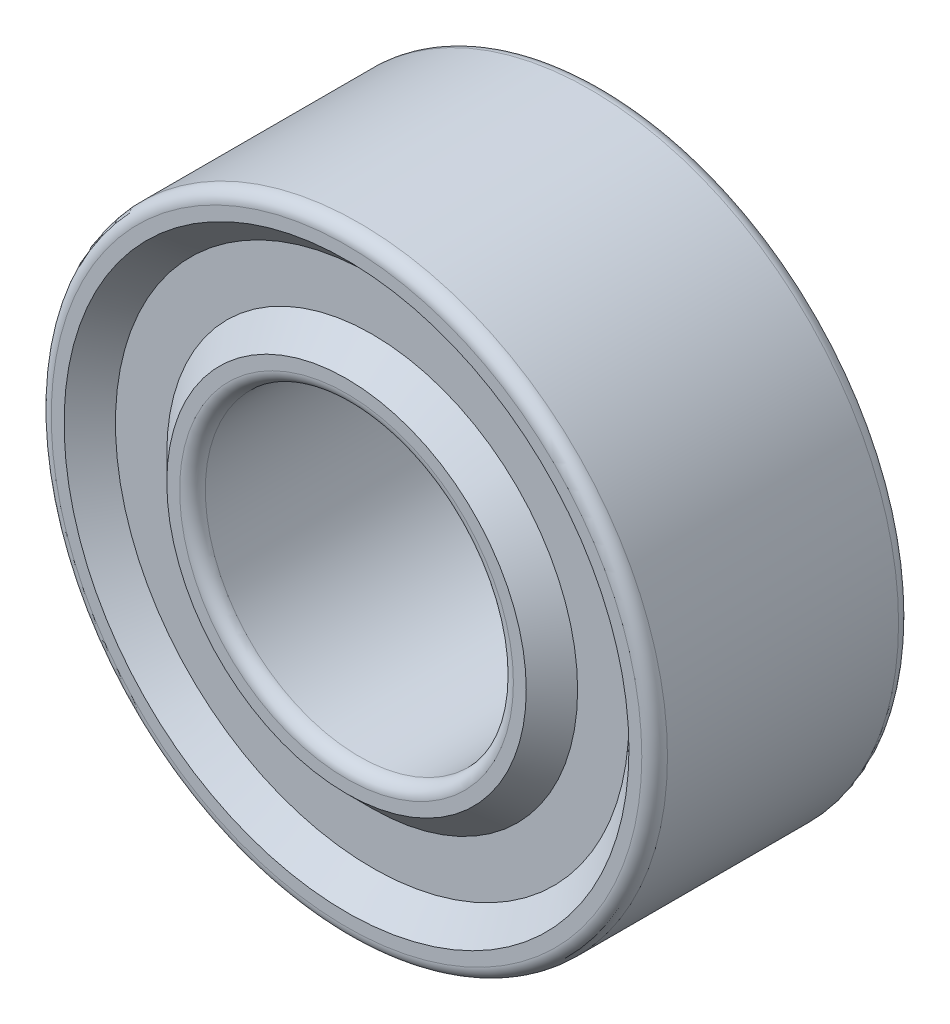
ISO-10303-21;
HEADER;
FILE_DESCRIPTION(('STEP AP214'),'2;1');
FILE_NAME('part.step','',(''),(''),'','','');
FILE_SCHEMA(('AUTOMOTIVE_DESIGN { 1 0 10303 214 1 1 1 1 }'));
ENDSEC;
DATA;
#1=APPLICATION_CONTEXT('core data for automotive mechanical design processes');
#2=APPLICATION_PROTOCOL_DEFINITION('international standard','automotive_design',2000,#1);
#3=PRODUCT_CONTEXT('',#1,'mechanical');
#4=PRODUCT('Part','Part','',(#3));
#5=PRODUCT_RELATED_PRODUCT_CATEGORY('part','',(#4));
#6=PRODUCT_DEFINITION_FORMATION('','',#4);
#7=PRODUCT_DEFINITION_CONTEXT('part definition',#1,'design');
#8=PRODUCT_DEFINITION('design','',#6,#7);
#9=PRODUCT_DEFINITION_SHAPE('','',#8);
#10=(LENGTH_UNIT() NAMED_UNIT(*) SI_UNIT(.MILLI.,.METRE.));
#11=(NAMED_UNIT(*) PLANE_ANGLE_UNIT() SI_UNIT($,.RADIAN.));
#12=(NAMED_UNIT(*) SI_UNIT($,.STERADIAN.) SOLID_ANGLE_UNIT());
#13=UNCERTAINTY_MEASURE_WITH_UNIT(LENGTH_MEASURE(1.E-05),#10,'distance_accuracy_value','');
#14=(GEOMETRIC_REPRESENTATION_CONTEXT(3) GLOBAL_UNCERTAINTY_ASSIGNED_CONTEXT((#13)) GLOBAL_UNIT_ASSIGNED_CONTEXT((#10,
#11,#12)) REPRESENTATION_CONTEXT('',''));
#15=CARTESIAN_POINT('',(0.,0.,0.));
#16=DIRECTION('',(0.,0.,1.));
#17=DIRECTION('',(1.,0.,0.));
#18=AXIS2_PLACEMENT_3D('',#15,#16,#17);
#19=CARTESIAN_POINT('',(0.,0.,0.));
#20=DIRECTION('',(0.,0.,1.));
#21=DIRECTION('',(1.,0.,0.));
#22=AXIS2_PLACEMENT_3D('',#19,#20,#21);
#23=PLANE('',#22);
#24=CARTESIAN_POINT('',(0.,0.,0.));
#25=DIRECTION('',(0.,0.,1.));
#26=DIRECTION('',(1.,0.,0.));
#27=AXIS2_PLACEMENT_3D('',#24,#25,#26);
#28=CIRCLE('',#27,1.625);
#29=CARTESIAN_POINT('',(1.625,0.,0.));
#30=VERTEX_POINT('',#29);
#31=EDGE_CURVE('E64',#30,#30,#28,.T.);
#32=ORIENTED_EDGE('',*,*,#31,.T.);
#33=EDGE_LOOP('',(#32));
#34=FACE_BOUND('',#33,.T.);
#35=CARTESIAN_POINT('',(0.,0.,0.));
#36=DIRECTION('',(0.,0.,1.));
#37=DIRECTION('',(1.,0.,0.));
#38=AXIS2_PLACEMENT_3D('',#35,#36,#37);
#39=CIRCLE('',#38,1.75);
#40=CARTESIAN_POINT('',(1.75,0.,0.));
#41=VERTEX_POINT('',#40);
#42=EDGE_CURVE('E97',#41,#41,#39,.T.);
#43=ORIENTED_EDGE('',*,*,#42,.F.);
#44=EDGE_LOOP('',(#43));
#45=FACE_BOUND('',#44,.T.);
#46=ADVANCED_FACE('F43',(#34,#45),#23,.F.);
#47=CARTESIAN_POINT('',(0.,0.,2.5));
#48=DIRECTION('',(0.,0.,1.));
#49=DIRECTION('',(1.,0.,0.));
#50=AXIS2_PLACEMENT_3D('',#47,#48,#49);
#51=PLANE('',#50);
#52=CARTESIAN_POINT('',(0.,0.,2.5));
#53=DIRECTION('',(0.,0.,1.));
#54=DIRECTION('',(1.,0.,0.));
#55=AXIS2_PLACEMENT_3D('',#52,#53,#54);
#56=CIRCLE('',#55,1.625);
#57=CARTESIAN_POINT('',(1.625,0.,2.5));
#58=VERTEX_POINT('',#57);
#59=EDGE_CURVE('E79',#58,#58,#56,.F.);
#60=ORIENTED_EDGE('',*,*,#59,.T.);
#61=EDGE_LOOP('',(#60));
#62=FACE_BOUND('',#61,.T.);
#63=CARTESIAN_POINT('',(0.,0.,2.5));
#64=DIRECTION('',(0.,0.,1.));
#65=DIRECTION('',(1.,0.,0.));
#66=AXIS2_PLACEMENT_3D('',#63,#64,#65);
#67=CIRCLE('',#66,1.75);
#68=CARTESIAN_POINT('',(1.75,0.,2.5));
#69=VERTEX_POINT('',#68);
#70=EDGE_CURVE('E91',#69,#69,#67,.T.);
#71=ORIENTED_EDGE('',*,*,#70,.T.);
#72=EDGE_LOOP('',(#71));
#73=FACE_BOUND('',#72,.T.);
#74=ADVANCED_FACE('F105',(#62,#73),#51,.T.);
#75=CARTESIAN_POINT('',(0.,0.,2.5));
#76=DIRECTION('',(0.,0.,1.));
#77=DIRECTION('',(1.,0.,0.));
#78=AXIS2_PLACEMENT_3D('',#75,#76,#77);
#79=CIRCLE('',#78,2.875);
#80=CARTESIAN_POINT('',(2.875,0.,2.5));
#81=VERTEX_POINT('',#80);
#82=EDGE_CURVE('E76',#81,#81,#79,.T.);
#83=ORIENTED_EDGE('',*,*,#82,.T.);
#84=EDGE_LOOP('',(#83));
#85=FACE_BOUND('',#84,.T.);
#86=CARTESIAN_POINT('',(0.,0.,2.5));
#87=DIRECTION('',(0.,0.,1.));
#88=DIRECTION('',(1.,0.,0.));
#89=AXIS2_PLACEMENT_3D('',#86,#87,#88);
#90=CIRCLE('',#89,2.75);
#91=CARTESIAN_POINT('',(2.75,0.,2.5));
#92=VERTEX_POINT('',#91);
#93=EDGE_CURVE('E88',#92,#92,#90,.T.);
#94=ORIENTED_EDGE('',*,*,#93,.F.);
#95=EDGE_LOOP('',(#94));
#96=FACE_BOUND('',#95,.T.);
#97=ADVANCED_FACE('F112',(#85,#96),#51,.T.);
#98=CARTESIAN_POINT('',(0.,0.,0.));
#99=DIRECTION('',(0.,0.,1.));
#100=DIRECTION('',(1.,0.,0.));
#101=AXIS2_PLACEMENT_3D('',#98,#99,#100);
#102=CIRCLE('',#101,2.875);
#103=CARTESIAN_POINT('',(2.875,0.,0.));
#104=VERTEX_POINT('',#103);
#105=EDGE_CURVE('E67',#104,#104,#102,.F.);
#106=ORIENTED_EDGE('',*,*,#105,.T.);
#107=EDGE_LOOP('',(#106));
#108=FACE_BOUND('',#107,.T.);
#109=CARTESIAN_POINT('',(0.,0.,0.));
#110=DIRECTION('',(0.,0.,1.));
#111=DIRECTION('',(1.,0.,0.));
#112=AXIS2_PLACEMENT_3D('',#109,#110,#111);
#113=CIRCLE('',#112,2.75);
#114=CARTESIAN_POINT('',(2.75,0.,0.));
#115=VERTEX_POINT('',#114);
#116=EDGE_CURVE('E94',#115,#115,#113,.T.);
#117=ORIENTED_EDGE('',*,*,#116,.T.);
#118=EDGE_LOOP('',(#117));
#119=FACE_BOUND('',#118,.T.);
#120=ADVANCED_FACE('F108',(#108,#119),#23,.F.);
#121=CARTESIAN_POINT('',(0.,0.,2.5));
#122=DIRECTION('',(0.,0.,-1.));
#123=DIRECTION('',(-1.,0.,0.));
#124=AXIS2_PLACEMENT_3D('',#121,#122,#123);
#125=CYLINDRICAL_SURFACE('',#124,3.);
#126=CARTESIAN_POINT('',(0.,0.,2.375));
#127=DIRECTION('',(0.,0.,1.));
#128=DIRECTION('',(1.,0.,0.));
#129=AXIS2_PLACEMENT_3D('',#126,#127,#128);
#130=CIRCLE('',#129,3.);
#131=CARTESIAN_POINT('',(3.,0.,2.375));
#132=VERTEX_POINT('',#131);
#133=EDGE_CURVE('E70',#132,#132,#130,.F.);
#134=ORIENTED_EDGE('',*,*,#133,.T.);
#135=EDGE_LOOP('',(#134));
#136=FACE_BOUND('',#135,.T.);
#137=CARTESIAN_POINT('',(0.,0.,0.125));
#138=DIRECTION('',(0.,0.,1.));
#139=DIRECTION('',(1.,0.,0.));
#140=AXIS2_PLACEMENT_3D('',#137,#138,#139);
#141=CIRCLE('',#140,3.);
#142=CARTESIAN_POINT('',(3.,0.,0.125));
#143=VERTEX_POINT('',#142);
#144=EDGE_CURVE('E73',#143,#143,#141,.T.);
#145=ORIENTED_EDGE('',*,*,#144,.T.);
#146=EDGE_LOOP('',(#145));
#147=FACE_BOUND('',#146,.T.);
#148=ADVANCED_FACE('F117',(#136,#147),#125,.T.);
#149=CARTESIAN_POINT('',(0.,0.,2.5));
#150=DIRECTION('',(0.,0.,-1.));
#151=DIRECTION('',(-1.,0.,0.));
#152=AXIS2_PLACEMENT_3D('',#149,#150,#151);
#153=CYLINDRICAL_SURFACE('',#152,1.5);
#154=CARTESIAN_POINT('',(0.,0.,2.375));
#155=DIRECTION('',(0.,0.,1.));
#156=DIRECTION('',(1.,0.,0.));
#157=AXIS2_PLACEMENT_3D('',#154,#155,#156);
#158=CIRCLE('',#157,1.5);
#159=CARTESIAN_POINT('',(1.5,0.,2.375));
#160=VERTEX_POINT('',#159);
#161=EDGE_CURVE('E82',#160,#160,#158,.T.);
#162=ORIENTED_EDGE('',*,*,#161,.T.);
#163=EDGE_LOOP('',(#162));
#164=FACE_BOUND('',#163,.T.);
#165=CARTESIAN_POINT('',(0.,0.,0.125));
#166=DIRECTION('',(0.,0.,1.));
#167=DIRECTION('',(1.,0.,0.));
#168=AXIS2_PLACEMENT_3D('',#165,#166,#167);
#169=CIRCLE('',#168,1.5);
#170=CARTESIAN_POINT('',(1.5,0.,0.125));
#171=VERTEX_POINT('',#170);
#172=EDGE_CURVE('E85',#171,#171,#169,.F.);
#173=ORIENTED_EDGE('',*,*,#172,.T.);
#174=EDGE_LOOP('',(#173));
#175=FACE_BOUND('',#174,.T.);
#176=ADVANCED_FACE('F123',(#164,#175),#153,.F.);
#177=CARTESIAN_POINT('',(0.,0.,2.25));
#178=DIRECTION('',(0.,0.,1.));
#179=DIRECTION('',(1.,0.,0.));
#180=AXIS2_PLACEMENT_3D('',#177,#178,#179);
#181=PLANE('',#180);
#182=CARTESIAN_POINT('',(0.,0.,2.25));
#183=DIRECTION('',(0.,0.,1.));
#184=DIRECTION('',(1.,0.,0.));
#185=AXIS2_PLACEMENT_3D('',#182,#183,#184);
#186=CIRCLE('',#185,2.5);
#187=CARTESIAN_POINT('',(2.5,0.,2.25));
#188=VERTEX_POINT('',#187);
#189=EDGE_CURVE('E55',#188,#188,#186,.T.);
#190=ORIENTED_EDGE('',*,*,#189,.T.);
#191=EDGE_LOOP('',(#190));
#192=FACE_BOUND('',#191,.T.);
#193=CARTESIAN_POINT('',(0.,0.,2.25));
#194=DIRECTION('',(0.,0.,1.));
#195=DIRECTION('',(1.,0.,0.));
#196=AXIS2_PLACEMENT_3D('',#193,#194,#195);
#197=CIRCLE('',#196,2.);
#198=CARTESIAN_POINT('',(2.,0.,2.25));
#199=VERTEX_POINT('',#198);
#200=EDGE_CURVE('E59',#199,#199,#197,.F.);
#201=ORIENTED_EDGE('',*,*,#200,.T.);
#202=EDGE_LOOP('',(#201));
#203=FACE_BOUND('',#202,.T.);
#204=ADVANCED_FACE('F175',(#192,#203),#181,.T.);
#205=CARTESIAN_POINT('',(0.,0.,0.25));
#206=DIRECTION('',(0.,0.,1.));
#207=DIRECTION('',(1.,0.,0.));
#208=AXIS2_PLACEMENT_3D('',#205,#206,#207);
#209=PLANE('',#208);
#210=CARTESIAN_POINT('',(0.,0.,0.25));
#211=DIRECTION('',(0.,0.,1.));
#212=DIRECTION('',(1.,0.,0.));
#213=AXIS2_PLACEMENT_3D('',#210,#211,#212);
#214=CIRCLE('',#213,2.);
#215=CARTESIAN_POINT('',(2.,0.,0.25));
#216=VERTEX_POINT('',#215);
#217=EDGE_CURVE('E10',#216,#216,#214,.T.);
#218=ORIENTED_EDGE('',*,*,#217,.T.);
#219=EDGE_LOOP('',(#218));
#220=FACE_BOUND('',#219,.T.);
#221=CARTESIAN_POINT('',(0.,0.,0.25));
#222=DIRECTION('',(0.,0.,1.));
#223=DIRECTION('',(1.,0.,0.));
#224=AXIS2_PLACEMENT_3D('',#221,#222,#223);
#225=CIRCLE('',#224,2.5);
#226=CARTESIAN_POINT('',(2.5,0.,0.25));
#227=VERTEX_POINT('',#226);
#228=EDGE_CURVE('E51',#227,#227,#225,.F.);
#229=ORIENTED_EDGE('',*,*,#228,.T.);
#230=EDGE_LOOP('',(#229));
#231=FACE_BOUND('',#230,.T.);
#232=ADVANCED_FACE('F169',(#220,#231),#209,.F.);
#233=CARTESIAN_POINT('',(0.,0.,2.375));
#234=DIRECTION('',(0.,0.,1.));
#235=DIRECTION('',(1.,0.,0.));
#236=AXIS2_PLACEMENT_3D('',#233,#234,#235);
#237=TOROIDAL_SURFACE('',#236,1.625,0.125);
#238=ORIENTED_EDGE('',*,*,#59,.F.);
#239=EDGE_LOOP('',(#238));
#240=FACE_BOUND('',#239,.T.);
#241=ORIENTED_EDGE('',*,*,#161,.F.);
#242=EDGE_LOOP('',(#241));
#243=FACE_BOUND('',#242,.T.);
#244=ADVANCED_FACE('F166',(#240,#243),#237,.T.);
#245=CARTESIAN_POINT('',(0.,0.,2.375));
#246=DIRECTION('',(0.,0.,1.));
#247=DIRECTION('',(1.,0.,0.));
#248=AXIS2_PLACEMENT_3D('',#245,#246,#247);
#249=TOROIDAL_SURFACE('',#248,2.875,0.125);
#250=ORIENTED_EDGE('',*,*,#133,.F.);
#251=EDGE_LOOP('',(#250));
#252=FACE_BOUND('',#251,.T.);
#253=ORIENTED_EDGE('',*,*,#82,.F.);
#254=EDGE_LOOP('',(#253));
#255=FACE_BOUND('',#254,.T.);
#256=ADVANCED_FACE('F162',(#252,#255),#249,.T.);
#257=CARTESIAN_POINT('',(0.,0.,0.125));
#258=DIRECTION('',(0.,0.,1.));
#259=DIRECTION('',(1.,0.,0.));
#260=AXIS2_PLACEMENT_3D('',#257,#258,#259);
#261=TOROIDAL_SURFACE('',#260,2.875,0.125);
#262=ORIENTED_EDGE('',*,*,#105,.F.);
#263=EDGE_LOOP('',(#262));
#264=FACE_BOUND('',#263,.T.);
#265=ORIENTED_EDGE('',*,*,#144,.F.);
#266=EDGE_LOOP('',(#265));
#267=FACE_BOUND('',#266,.T.);
#268=ADVANCED_FACE('F158',(#264,#267),#261,.T.);
#269=CARTESIAN_POINT('',(0.,0.,0.125));
#270=DIRECTION('',(0.,0.,1.));
#271=DIRECTION('',(1.,0.,0.));
#272=AXIS2_PLACEMENT_3D('',#269,#270,#271);
#273=TOROIDAL_SURFACE('',#272,1.625,0.125);
#274=ORIENTED_EDGE('',*,*,#172,.F.);
#275=EDGE_LOOP('',(#274));
#276=FACE_BOUND('',#275,.T.);
#277=ORIENTED_EDGE('',*,*,#31,.F.);
#278=EDGE_LOOP('',(#277));
#279=FACE_BOUND('',#278,.T.);
#280=ADVANCED_FACE('F154',(#276,#279),#273,.T.);
#281=CARTESIAN_POINT('',(0.,0.,2.25));
#282=DIRECTION('',(0.,0.,1.));
#283=DIRECTION('',(1.,0.,0.));
#284=AXIS2_PLACEMENT_3D('',#281,#282,#283);
#285=CONICAL_SURFACE('',#284,2.5,0.785398163397452);
#286=ORIENTED_EDGE('',*,*,#93,.T.);
#287=EDGE_LOOP('',(#286));
#288=FACE_BOUND('',#287,.T.);
#289=ORIENTED_EDGE('',*,*,#189,.F.);
#290=EDGE_LOOP('',(#289));
#291=FACE_BOUND('',#290,.T.);
#292=ADVANCED_FACE('F139',(#288,#291),#285,.F.);
#293=CARTESIAN_POINT('',(0.,0.,2.5));
#294=DIRECTION('',(0.,0.,-1.));
#295=DIRECTION('',(-1.,0.,0.));
#296=AXIS2_PLACEMENT_3D('',#293,#294,#295);
#297=CONICAL_SURFACE('',#296,1.75,0.785398163397443);
#298=ORIENTED_EDGE('',*,*,#200,.F.);
#299=EDGE_LOOP('',(#298));
#300=FACE_BOUND('',#299,.T.);
#301=ORIENTED_EDGE('',*,*,#70,.F.);
#302=EDGE_LOOP('',(#301));
#303=FACE_BOUND('',#302,.T.);
#304=ADVANCED_FACE('F135',(#300,#303),#297,.T.);
#305=CARTESIAN_POINT('',(0.,0.,0.25));
#306=DIRECTION('',(0.,0.,1.));
#307=DIRECTION('',(1.,0.,0.));
#308=AXIS2_PLACEMENT_3D('',#305,#306,#307);
#309=CONICAL_SURFACE('',#308,2.,0.785398163397453);
#310=ORIENTED_EDGE('',*,*,#42,.T.);
#311=EDGE_LOOP('',(#310));
#312=FACE_BOUND('',#311,.T.);
#313=ORIENTED_EDGE('',*,*,#217,.F.);
#314=EDGE_LOOP('',(#313));
#315=FACE_BOUND('',#314,.T.);
#316=ADVANCED_FACE('F101',(#312,#315),#309,.T.);
#317=CARTESIAN_POINT('',(0.,0.,0.));
#318=DIRECTION('',(0.,0.,-1.));
#319=DIRECTION('',(-1.,0.,0.));
#320=AXIS2_PLACEMENT_3D('',#317,#318,#319);
#321=CONICAL_SURFACE('',#320,2.75,0.785398163397442);
#322=ORIENTED_EDGE('',*,*,#228,.F.);
#323=EDGE_LOOP('',(#322));
#324=FACE_BOUND('',#323,.T.);
#325=ORIENTED_EDGE('',*,*,#116,.F.);
#326=EDGE_LOOP('',(#325));
#327=FACE_BOUND('',#326,.T.);
#328=ADVANCED_FACE('F46',(#324,#327),#321,.F.);
#329=CLOSED_SHELL('',(#46,#74,#97,#120,#148,#176,#204,#232,#244,#256,#268,#280,#292,#304,#316,#328));
#330=MANIFOLD_SOLID_BREP('B2',#329);
#331=ADVANCED_BREP_SHAPE_REPRESENTATION('',(#18,#330),#14);
#332=SHAPE_DEFINITION_REPRESENTATION(#9,#331);
ENDSEC;
END-ISO-10303-21;
